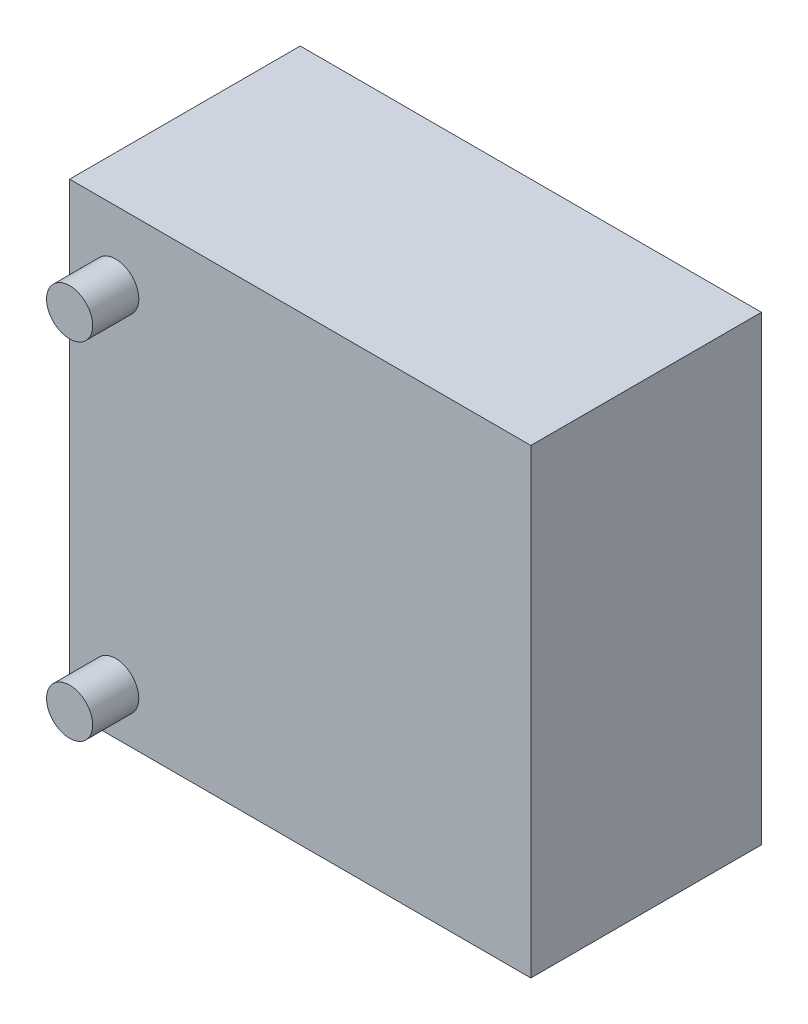
ISO-10303-21;
HEADER;
FILE_DESCRIPTION(('STEP AP214'),'2;1');
FILE_NAME('part.step','',(''),(''),'','','');
FILE_SCHEMA(('AUTOMOTIVE_DESIGN { 1 0 10303 214 1 1 1 1 }'));
ENDSEC;
DATA;
#1=APPLICATION_CONTEXT('core data for automotive mechanical design processes');
#2=APPLICATION_PROTOCOL_DEFINITION('international standard','automotive_design',2000,#1);
#3=PRODUCT_CONTEXT('',#1,'mechanical');
#4=PRODUCT('Part','Part','',(#3));
#5=PRODUCT_RELATED_PRODUCT_CATEGORY('part','',(#4));
#6=PRODUCT_DEFINITION_FORMATION('','',#4);
#7=PRODUCT_DEFINITION_CONTEXT('part definition',#1,'design');
#8=PRODUCT_DEFINITION('design','',#6,#7);
#9=PRODUCT_DEFINITION_SHAPE('','',#8);
#10=(LENGTH_UNIT() NAMED_UNIT(*) SI_UNIT(.MILLI.,.METRE.));
#11=(NAMED_UNIT(*) PLANE_ANGLE_UNIT() SI_UNIT($,.RADIAN.));
#12=(NAMED_UNIT(*) SI_UNIT($,.STERADIAN.) SOLID_ANGLE_UNIT());
#13=UNCERTAINTY_MEASURE_WITH_UNIT(LENGTH_MEASURE(1.E-05),#10,'distance_accuracy_value','');
#14=(GEOMETRIC_REPRESENTATION_CONTEXT(3) GLOBAL_UNCERTAINTY_ASSIGNED_CONTEXT((#13)) GLOBAL_UNIT_ASSIGNED_CONTEXT((#10,
#11,#12)) REPRESENTATION_CONTEXT('',''));
#15=CARTESIAN_POINT('',(0.,0.,0.));
#16=DIRECTION('',(0.,0.,1.));
#17=DIRECTION('',(1.,0.,0.));
#18=AXIS2_PLACEMENT_3D('',#15,#16,#17);
#19=CARTESIAN_POINT('',(0.,0.,10.));
#20=DIRECTION('',(1.,0.,0.));
#21=DIRECTION('',(0.,0.,-1.));
#22=AXIS2_PLACEMENT_3D('',#19,#20,#21);
#23=PLANE('',#22);
#24=DIRECTION('',(0.,-1.,0.));
#25=VECTOR('',#24,1.);
#26=CARTESIAN_POINT('',(0.,0.,0.));
#27=LINE('',#26,#25);
#28=CARTESIAN_POINT('',(0.,20.,0.));
#29=VERTEX_POINT('',#28);
#30=CARTESIAN_POINT('',(0.,0.,0.));
#31=VERTEX_POINT('',#30);
#32=EDGE_CURVE('E108',#29,#31,#27,.T.);
#33=ORIENTED_EDGE('',*,*,#32,.T.);
#34=DIRECTION('',(0.,0.,-1.));
#35=VECTOR('',#34,1.);
#36=CARTESIAN_POINT('',(0.,0.,10.));
#37=LINE('',#36,#35);
#38=CARTESIAN_POINT('',(0.,0.,10.));
#39=VERTEX_POINT('',#38);
#40=EDGE_CURVE('E99',#39,#31,#37,.T.);
#41=ORIENTED_EDGE('',*,*,#40,.F.);
#42=DIRECTION('',(0.,-1.,0.));
#43=VECTOR('',#42,1.);
#44=CARTESIAN_POINT('',(0.,0.,10.));
#45=LINE('',#44,#43);
#46=CARTESIAN_POINT('',(0.,20.,10.));
#47=VERTEX_POINT('',#46);
#48=EDGE_CURVE('E94',#47,#39,#45,.T.);
#49=ORIENTED_EDGE('',*,*,#48,.F.);
#50=DIRECTION('',(0.,0.,-1.));
#51=VECTOR('',#50,1.);
#52=CARTESIAN_POINT('',(0.,20.,10.));
#53=LINE('',#52,#51);
#54=EDGE_CURVE('E104',#47,#29,#53,.T.);
#55=ORIENTED_EDGE('',*,*,#54,.T.);
#56=EDGE_LOOP('',(#33,#41,#49,#55));
#57=FACE_BOUND('',#56,.T.);
#58=ADVANCED_FACE('F45',(#57),#23,.F.);
#59=CARTESIAN_POINT('',(0.,0.,10.));
#60=DIRECTION('',(0.,1.,0.));
#61=DIRECTION('',(0.,0.,1.));
#62=AXIS2_PLACEMENT_3D('',#59,#60,#61);
#63=PLANE('',#62);
#64=DIRECTION('',(1.,0.,0.));
#65=VECTOR('',#64,1.);
#66=CARTESIAN_POINT('',(0.,0.,0.));
#67=LINE('',#66,#65);
#68=CARTESIAN_POINT('',(20.,0.,0.));
#69=VERTEX_POINT('',#68);
#70=EDGE_CURVE('E97',#31,#69,#67,.T.);
#71=ORIENTED_EDGE('',*,*,#70,.T.);
#72=DIRECTION('',(0.,0.,-1.));
#73=VECTOR('',#72,1.);
#74=CARTESIAN_POINT('',(20.,0.,10.));
#75=LINE('',#74,#73);
#76=CARTESIAN_POINT('',(20.,0.,10.));
#77=VERTEX_POINT('',#76);
#78=EDGE_CURVE('E100',#77,#69,#75,.T.);
#79=ORIENTED_EDGE('',*,*,#78,.F.);
#80=DIRECTION('',(1.,0.,0.));
#81=VECTOR('',#80,1.);
#82=CARTESIAN_POINT('',(0.,0.,10.));
#83=LINE('',#82,#81);
#84=EDGE_CURVE('E90',#39,#77,#83,.T.);
#85=ORIENTED_EDGE('',*,*,#84,.F.);
#86=ORIENTED_EDGE('',*,*,#40,.T.);
#87=EDGE_LOOP('',(#71,#79,#85,#86));
#88=FACE_BOUND('',#87,.T.);
#89=ADVANCED_FACE('F98',(#88),#63,.F.);
#90=CARTESIAN_POINT('',(20.,0.,10.));
#91=DIRECTION('',(-1.,0.,0.));
#92=DIRECTION('',(0.,0.,1.));
#93=AXIS2_PLACEMENT_3D('',#90,#91,#92);
#94=PLANE('',#93);
#95=DIRECTION('',(0.,1.,0.));
#96=VECTOR('',#95,1.);
#97=CARTESIAN_POINT('',(20.,0.,0.));
#98=LINE('',#97,#96);
#99=CARTESIAN_POINT('',(20.,20.,0.));
#100=VERTEX_POINT('',#99);
#101=EDGE_CURVE('E73',#69,#100,#98,.T.);
#102=ORIENTED_EDGE('',*,*,#101,.T.);
#103=DIRECTION('',(0.,0.,-1.));
#104=VECTOR('',#103,1.);
#105=CARTESIAN_POINT('',(20.,20.,10.));
#106=LINE('',#105,#104);
#107=CARTESIAN_POINT('',(20.,20.,10.));
#108=VERTEX_POINT('',#107);
#109=EDGE_CURVE('E101',#108,#100,#106,.T.);
#110=ORIENTED_EDGE('',*,*,#109,.F.);
#111=DIRECTION('',(0.,1.,0.));
#112=VECTOR('',#111,1.);
#113=CARTESIAN_POINT('',(20.,0.,10.));
#114=LINE('',#113,#112);
#115=EDGE_CURVE('E95',#77,#108,#114,.T.);
#116=ORIENTED_EDGE('',*,*,#115,.F.);
#117=ORIENTED_EDGE('',*,*,#78,.T.);
#118=EDGE_LOOP('',(#102,#110,#116,#117));
#119=FACE_BOUND('',#118,.T.);
#120=ADVANCED_FACE('F103',(#119),#94,.F.);
#121=CARTESIAN_POINT('',(0.,20.,10.));
#122=DIRECTION('',(0.,-1.,0.));
#123=DIRECTION('',(0.,0.,-1.));
#124=AXIS2_PLACEMENT_3D('',#121,#122,#123);
#125=PLANE('',#124);
#126=DIRECTION('',(-1.,0.,0.));
#127=VECTOR('',#126,1.);
#128=CARTESIAN_POINT('',(0.,20.,0.));
#129=LINE('',#128,#127);
#130=EDGE_CURVE('E82',#100,#29,#129,.T.);
#131=ORIENTED_EDGE('',*,*,#130,.T.);
#132=ORIENTED_EDGE('',*,*,#54,.F.);
#133=DIRECTION('',(-1.,0.,0.));
#134=VECTOR('',#133,1.);
#135=CARTESIAN_POINT('',(0.,20.,10.));
#136=LINE('',#135,#134);
#137=EDGE_CURVE('E59',#108,#47,#136,.T.);
#138=ORIENTED_EDGE('',*,*,#137,.F.);
#139=ORIENTED_EDGE('',*,*,#109,.T.);
#140=EDGE_LOOP('',(#131,#132,#138,#139));
#141=FACE_BOUND('',#140,.T.);
#142=ADVANCED_FACE('F136',(#141),#125,.F.);
#143=CARTESIAN_POINT('',(0.,0.,10.));
#144=DIRECTION('',(0.,0.,-1.));
#145=DIRECTION('',(-1.,0.,0.));
#146=AXIS2_PLACEMENT_3D('',#143,#144,#145);
#147=PLANE('',#146);
#148=CARTESIAN_POINT('',(2.,17.,10.));
#149=DIRECTION('',(0.,0.,-1.));
#150=DIRECTION('',(-1.,0.,0.));
#151=AXIS2_PLACEMENT_3D('',#148,#149,#150);
#152=CIRCLE('',#151,1.);
#153=CARTESIAN_POINT('',(1.,17.,10.));
#154=VERTEX_POINT('',#153);
#155=EDGE_CURVE('E11',#154,#154,#152,.F.);
#156=ORIENTED_EDGE('',*,*,#155,.F.);
#157=EDGE_LOOP('',(#156));
#158=FACE_BOUND('',#157,.T.);
#159=CARTESIAN_POINT('',(2.,2.,10.));
#160=DIRECTION('',(0.,0.,1.));
#161=DIRECTION('',(1.,0.,0.));
#162=AXIS2_PLACEMENT_3D('',#159,#160,#161);
#163=CIRCLE('',#162,1.);
#164=CARTESIAN_POINT('',(3.,2.,10.));
#165=VERTEX_POINT('',#164);
#166=EDGE_CURVE('E49',#165,#165,#163,.T.);
#167=ORIENTED_EDGE('',*,*,#166,.F.);
#168=EDGE_LOOP('',(#167));
#169=FACE_BOUND('',#168,.T.);
#170=ORIENTED_EDGE('',*,*,#48,.T.);
#171=ORIENTED_EDGE('',*,*,#84,.T.);
#172=ORIENTED_EDGE('',*,*,#115,.T.);
#173=ORIENTED_EDGE('',*,*,#137,.T.);
#174=EDGE_LOOP('',(#170,#171,#172,#173));
#175=FACE_BOUND('',#174,.T.);
#176=ADVANCED_FACE('F89',(#158,#169,#175),#147,.F.);
#177=CARTESIAN_POINT('',(0.,0.,0.));
#178=DIRECTION('',(0.,0.,-1.));
#179=DIRECTION('',(-1.,0.,0.));
#180=AXIS2_PLACEMENT_3D('',#177,#178,#179);
#181=PLANE('',#180);
#182=ORIENTED_EDGE('',*,*,#32,.F.);
#183=ORIENTED_EDGE('',*,*,#130,.F.);
#184=ORIENTED_EDGE('',*,*,#101,.F.);
#185=ORIENTED_EDGE('',*,*,#70,.F.);
#186=EDGE_LOOP('',(#182,#183,#184,#185));
#187=FACE_BOUND('',#186,.T.);
#188=ADVANCED_FACE('F139',(#187),#181,.T.);
#189=CARTESIAN_POINT('',(2.,2.,12.));
#190=DIRECTION('',(0.,0.,-1.));
#191=DIRECTION('',(-1.,0.,0.));
#192=AXIS2_PLACEMENT_3D('',#189,#190,#191);
#193=CYLINDRICAL_SURFACE('',#192,1.);
#194=CARTESIAN_POINT('',(2.,2.,12.));
#195=DIRECTION('',(0.,0.,1.));
#196=DIRECTION('',(1.,0.,0.));
#197=AXIS2_PLACEMENT_3D('',#194,#195,#196);
#198=CIRCLE('',#197,1.);
#199=CARTESIAN_POINT('',(3.,2.,12.));
#200=VERTEX_POINT('',#199);
#201=EDGE_CURVE('E115',#200,#200,#198,.T.);
#202=ORIENTED_EDGE('',*,*,#201,.F.);
#203=EDGE_LOOP('',(#202));
#204=FACE_BOUND('',#203,.T.);
#205=ORIENTED_EDGE('',*,*,#166,.T.);
#206=EDGE_LOOP('',(#205));
#207=FACE_BOUND('',#206,.T.);
#208=ADVANCED_FACE('F148',(#204,#207),#193,.T.);
#209=CARTESIAN_POINT('',(2.,2.,12.));
#210=DIRECTION('',(0.,0.,1.));
#211=DIRECTION('',(1.,0.,0.));
#212=AXIS2_PLACEMENT_3D('',#209,#210,#211);
#213=PLANE('',#212);
#214=ORIENTED_EDGE('',*,*,#201,.T.);
#215=EDGE_LOOP('',(#214));
#216=FACE_BOUND('',#215,.T.);
#217=ADVANCED_FACE('F132',(#216),#213,.T.);
#218=CARTESIAN_POINT('',(2.,17.,12.));
#219=DIRECTION('',(0.,0.,-1.));
#220=DIRECTION('',(-1.,0.,0.));
#221=AXIS2_PLACEMENT_3D('',#218,#219,#220);
#222=CYLINDRICAL_SURFACE('',#221,1.);
#223=CARTESIAN_POINT('',(2.,17.,12.));
#224=DIRECTION('',(0.,0.,1.));
#225=DIRECTION('',(1.,0.,0.));
#226=AXIS2_PLACEMENT_3D('',#223,#224,#225);
#227=CIRCLE('',#226,1.);
#228=CARTESIAN_POINT('',(3.,17.,12.));
#229=VERTEX_POINT('',#228);
#230=EDGE_CURVE('E122',#229,#229,#227,.T.);
#231=ORIENTED_EDGE('',*,*,#230,.F.);
#232=EDGE_LOOP('',(#231));
#233=FACE_BOUND('',#232,.T.);
#234=ORIENTED_EDGE('',*,*,#155,.T.);
#235=EDGE_LOOP('',(#234));
#236=FACE_BOUND('',#235,.T.);
#237=ADVANCED_FACE('F128',(#233,#236),#222,.T.);
#238=CARTESIAN_POINT('',(2.,17.,12.));
#239=DIRECTION('',(0.,0.,1.));
#240=DIRECTION('',(1.,0.,0.));
#241=AXIS2_PLACEMENT_3D('',#238,#239,#240);
#242=PLANE('',#241);
#243=ORIENTED_EDGE('',*,*,#230,.T.);
#244=EDGE_LOOP('',(#243));
#245=FACE_BOUND('',#244,.T.);
#246=ADVANCED_FACE('F126',(#245),#242,.T.);
#247=CLOSED_SHELL('',(#58,#89,#120,#142,#176,#188,#208,#217,#237,#246));
#248=MANIFOLD_SOLID_BREP('B2',#247);
#249=ADVANCED_BREP_SHAPE_REPRESENTATION('',(#18,#248),#14);
#250=SHAPE_DEFINITION_REPRESENTATION(#9,#249);
ENDSEC;
END-ISO-10303-21;
